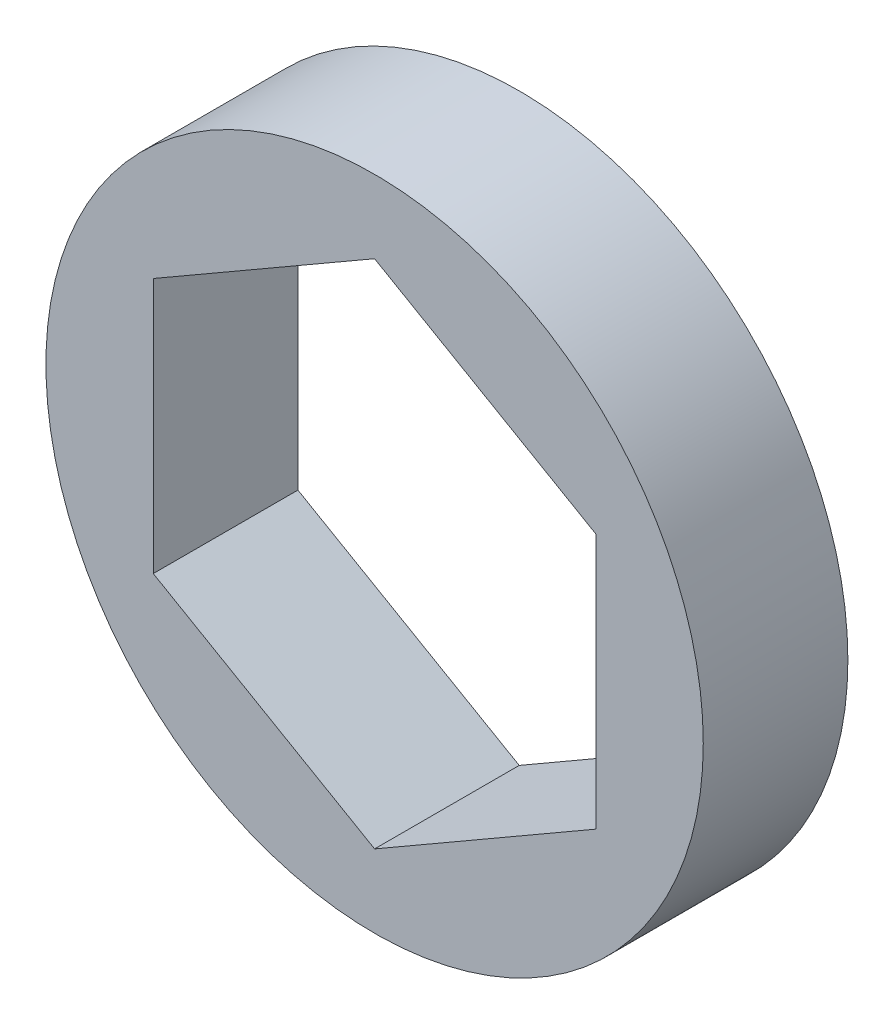
ISO-10303-21;
HEADER;
FILE_DESCRIPTION(('STEP AP214'),'2;1');
FILE_NAME('part.step','',(''),(''),'','','');
FILE_SCHEMA(('AUTOMOTIVE_DESIGN { 1 0 10303 214 1 1 1 1 }'));
ENDSEC;
DATA;
#1=APPLICATION_CONTEXT('core data for automotive mechanical design processes');
#2=APPLICATION_PROTOCOL_DEFINITION('international standard','automotive_design',2000,#1);
#3=PRODUCT_CONTEXT('',#1,'mechanical');
#4=PRODUCT('Part','Part','',(#3));
#5=PRODUCT_RELATED_PRODUCT_CATEGORY('part','',(#4));
#6=PRODUCT_DEFINITION_FORMATION('','',#4);
#7=PRODUCT_DEFINITION_CONTEXT('part definition',#1,'design');
#8=PRODUCT_DEFINITION('design','',#6,#7);
#9=PRODUCT_DEFINITION_SHAPE('','',#8);
#10=(LENGTH_UNIT() NAMED_UNIT(*) SI_UNIT(.MILLI.,.METRE.));
#11=(NAMED_UNIT(*) PLANE_ANGLE_UNIT() SI_UNIT($,.RADIAN.));
#12=(NAMED_UNIT(*) SI_UNIT($,.STERADIAN.) SOLID_ANGLE_UNIT());
#13=UNCERTAINTY_MEASURE_WITH_UNIT(LENGTH_MEASURE(1.E-05),#10,'distance_accuracy_value','');
#14=(GEOMETRIC_REPRESENTATION_CONTEXT(3) GLOBAL_UNCERTAINTY_ASSIGNED_CONTEXT((#13)) GLOBAL_UNIT_ASSIGNED_CONTEXT((#10,
#11,#12)) REPRESENTATION_CONTEXT('',''));
#15=CARTESIAN_POINT('',(0.,0.,0.));
#16=DIRECTION('',(0.,0.,1.));
#17=DIRECTION('',(1.,0.,0.));
#18=AXIS2_PLACEMENT_3D('',#15,#16,#17);
#19=CARTESIAN_POINT('',(0.,0.,4.191));
#20=DIRECTION('',(0.,0.,1.));
#21=DIRECTION('',(1.,0.,0.));
#22=AXIS2_PLACEMENT_3D('',#19,#20,#21);
#23=PLANE('',#22);
#24=CARTESIAN_POINT('',(0.,0.,4.191));
#25=DIRECTION('',(0.,0.,1.));
#26=DIRECTION('',(1.,0.,0.));
#27=AXIS2_PLACEMENT_3D('',#24,#25,#26);
#28=CIRCLE('',#27,9.525);
#29=CARTESIAN_POINT('',(9.525,0.,4.191));
#30=VERTEX_POINT('',#29);
#31=EDGE_CURVE('E11',#30,#30,#28,.T.);
#32=ORIENTED_EDGE('',*,*,#31,.T.);
#33=EDGE_LOOP('',(#32));
#34=FACE_BOUND('',#33,.T.);
#35=DIRECTION('',(-0.866025403784439,0.5,0.));
#36=VECTOR('',#35,1.);
#37=CARTESIAN_POINT('',(6.4135,3.70283595144767,4.191));
#38=LINE('',#37,#36);
#39=CARTESIAN_POINT('',(6.4135,3.70283595144767,4.191));
#40=VERTEX_POINT('',#39);
#41=CARTESIAN_POINT('',(0.,7.40567190289533,4.191));
#42=VERTEX_POINT('',#41);
#43=EDGE_CURVE('E112',#40,#42,#38,.T.);
#44=ORIENTED_EDGE('',*,*,#43,.F.);
#45=DIRECTION('',(0.,1.,0.));
#46=VECTOR('',#45,1.);
#47=CARTESIAN_POINT('',(6.4135,-3.70283595144767,4.191));
#48=LINE('',#47,#46);
#49=CARTESIAN_POINT('',(6.4135,-3.70283595144767,4.191));
#50=VERTEX_POINT('',#49);
#51=EDGE_CURVE('E103',#50,#40,#48,.T.);
#52=ORIENTED_EDGE('',*,*,#51,.F.);
#53=DIRECTION('',(0.866025403784439,0.5,0.));
#54=VECTOR('',#53,1.);
#55=CARTESIAN_POINT('',(0.,-7.40567190289533,4.191));
#56=LINE('',#55,#54);
#57=CARTESIAN_POINT('',(0.,-7.40567190289533,4.191));
#58=VERTEX_POINT('',#57);
#59=EDGE_CURVE('E137',#58,#50,#56,.T.);
#60=ORIENTED_EDGE('',*,*,#59,.F.);
#61=DIRECTION('',(0.866025403784439,-0.5,0.));
#62=VECTOR('',#61,1.);
#63=CARTESIAN_POINT('',(-6.4135,-3.70283595144767,4.191));
#64=LINE('',#63,#62);
#65=CARTESIAN_POINT('',(-6.4135,-3.70283595144767,4.191));
#66=VERTEX_POINT('',#65);
#67=EDGE_CURVE('E134',#66,#58,#64,.T.);
#68=ORIENTED_EDGE('',*,*,#67,.F.);
#69=DIRECTION('',(0.,-1.,0.));
#70=VECTOR('',#69,1.);
#71=CARTESIAN_POINT('',(-6.4135,3.70283595144767,4.191));
#72=LINE('',#71,#70);
#73=CARTESIAN_POINT('',(-6.4135,3.70283595144767,4.191));
#74=VERTEX_POINT('',#73);
#75=EDGE_CURVE('E129',#74,#66,#72,.T.);
#76=ORIENTED_EDGE('',*,*,#75,.F.);
#77=DIRECTION('',(-0.866025403784439,-0.5,0.));
#78=VECTOR('',#77,1.);
#79=CARTESIAN_POINT('',(0.,7.40567190289533,4.191));
#80=LINE('',#79,#78);
#81=EDGE_CURVE('E125',#42,#74,#80,.T.);
#82=ORIENTED_EDGE('',*,*,#81,.F.);
#83=EDGE_LOOP('',(#44,#52,#60,#68,#76,#82));
#84=FACE_BOUND('',#83,.T.);
#85=ADVANCED_FACE('F49',(#34,#84),#23,.T.);
#86=CARTESIAN_POINT('',(0.,0.,0.));
#87=DIRECTION('',(0.,0.,1.));
#88=DIRECTION('',(1.,0.,0.));
#89=AXIS2_PLACEMENT_3D('',#86,#87,#88);
#90=PLANE('',#89);
#91=CARTESIAN_POINT('',(0.,0.,0.));
#92=DIRECTION('',(0.,0.,1.));
#93=DIRECTION('',(1.,0.,0.));
#94=AXIS2_PLACEMENT_3D('',#91,#92,#93);
#95=CIRCLE('',#94,9.525);
#96=CARTESIAN_POINT('',(9.525,0.,0.));
#97=VERTEX_POINT('',#96);
#98=EDGE_CURVE('E53',#97,#97,#95,.T.);
#99=ORIENTED_EDGE('',*,*,#98,.F.);
#100=EDGE_LOOP('',(#99));
#101=FACE_BOUND('',#100,.T.);
#102=DIRECTION('',(0.,1.,0.));
#103=VECTOR('',#102,1.);
#104=CARTESIAN_POINT('',(6.4135,-3.70283595144767,0.));
#105=LINE('',#104,#103);
#106=CARTESIAN_POINT('',(6.4135,-3.70283595144767,0.));
#107=VERTEX_POINT('',#106);
#108=CARTESIAN_POINT('',(6.4135,3.70283595144767,0.));
#109=VERTEX_POINT('',#108);
#110=EDGE_CURVE('E73',#107,#109,#105,.T.);
#111=ORIENTED_EDGE('',*,*,#110,.T.);
#112=DIRECTION('',(-0.866025403784439,0.5,0.));
#113=VECTOR('',#112,1.);
#114=CARTESIAN_POINT('',(6.4135,3.70283595144767,0.));
#115=LINE('',#114,#113);
#116=CARTESIAN_POINT('',(0.,7.40567190289533,0.));
#117=VERTEX_POINT('',#116);
#118=EDGE_CURVE('E119',#109,#117,#115,.T.);
#119=ORIENTED_EDGE('',*,*,#118,.T.);
#120=DIRECTION('',(-0.866025403784439,-0.5,0.));
#121=VECTOR('',#120,1.);
#122=CARTESIAN_POINT('',(0.,7.40567190289533,0.));
#123=LINE('',#122,#121);
#124=CARTESIAN_POINT('',(-6.4135,3.70283595144767,0.));
#125=VERTEX_POINT('',#124);
#126=EDGE_CURVE('E144',#117,#125,#123,.T.);
#127=ORIENTED_EDGE('',*,*,#126,.T.);
#128=DIRECTION('',(0.,-1.,0.));
#129=VECTOR('',#128,1.);
#130=CARTESIAN_POINT('',(-6.4135,3.70283595144767,0.));
#131=LINE('',#130,#129);
#132=CARTESIAN_POINT('',(-6.4135,-3.70283595144767,0.));
#133=VERTEX_POINT('',#132);
#134=EDGE_CURVE('E148',#125,#133,#131,.T.);
#135=ORIENTED_EDGE('',*,*,#134,.T.);
#136=DIRECTION('',(0.866025403784439,-0.5,0.));
#137=VECTOR('',#136,1.);
#138=CARTESIAN_POINT('',(-6.4135,-3.70283595144767,0.));
#139=LINE('',#138,#137);
#140=CARTESIAN_POINT('',(0.,-7.40567190289533,0.));
#141=VERTEX_POINT('',#140);
#142=EDGE_CURVE('E152',#133,#141,#139,.T.);
#143=ORIENTED_EDGE('',*,*,#142,.T.);
#144=DIRECTION('',(0.866025403784439,0.5,0.));
#145=VECTOR('',#144,1.);
#146=CARTESIAN_POINT('',(0.,-7.40567190289533,0.));
#147=LINE('',#146,#145);
#148=EDGE_CURVE('E113',#141,#107,#147,.T.);
#149=ORIENTED_EDGE('',*,*,#148,.T.);
#150=EDGE_LOOP('',(#111,#119,#127,#135,#143,#149));
#151=FACE_BOUND('',#150,.T.);
#152=ADVANCED_FACE('F176',(#101,#151),#90,.F.);
#153=CARTESIAN_POINT('',(0.,0.,4.191));
#154=DIRECTION('',(0.,0.,-1.));
#155=DIRECTION('',(-1.,0.,0.));
#156=AXIS2_PLACEMENT_3D('',#153,#154,#155);
#157=CYLINDRICAL_SURFACE('',#156,9.525);
#158=ORIENTED_EDGE('',*,*,#31,.F.);
#159=EDGE_LOOP('',(#158));
#160=FACE_BOUND('',#159,.T.);
#161=ORIENTED_EDGE('',*,*,#98,.T.);
#162=EDGE_LOOP('',(#161));
#163=FACE_BOUND('',#162,.T.);
#164=ADVANCED_FACE('F51',(#160,#163),#157,.T.);
#165=CARTESIAN_POINT('',(6.4135,-3.70283595144767,4.191));
#166=DIRECTION('',(-1.,0.,0.));
#167=DIRECTION('',(0.,-1.,0.));
#168=AXIS2_PLACEMENT_3D('',#165,#166,#167);
#169=PLANE('',#168);
#170=ORIENTED_EDGE('',*,*,#110,.F.);
#171=DIRECTION('',(0.,0.,-1.));
#172=VECTOR('',#171,1.);
#173=CARTESIAN_POINT('',(6.4135,-3.70283595144767,4.191));
#174=LINE('',#173,#172);
#175=EDGE_CURVE('E107',#50,#107,#174,.T.);
#176=ORIENTED_EDGE('',*,*,#175,.F.);
#177=ORIENTED_EDGE('',*,*,#51,.T.);
#178=DIRECTION('',(0.,0.,-1.));
#179=VECTOR('',#178,1.);
#180=CARTESIAN_POINT('',(6.4135,3.70283595144767,4.191));
#181=LINE('',#180,#179);
#182=EDGE_CURVE('E106',#40,#109,#181,.T.);
#183=ORIENTED_EDGE('',*,*,#182,.T.);
#184=EDGE_LOOP('',(#170,#176,#177,#183));
#185=FACE_BOUND('',#184,.T.);
#186=ADVANCED_FACE('F105',(#185),#169,.T.);
#187=CARTESIAN_POINT('',(6.4135,3.70283595144767,4.191));
#188=DIRECTION('',(-0.5,-0.866025403784439,0.));
#189=DIRECTION('',(0.866025403784439,-0.5,0.));
#190=AXIS2_PLACEMENT_3D('',#187,#188,#189);
#191=PLANE('',#190);
#192=ORIENTED_EDGE('',*,*,#118,.F.);
#193=ORIENTED_EDGE('',*,*,#182,.F.);
#194=ORIENTED_EDGE('',*,*,#43,.T.);
#195=DIRECTION('',(0.,0.,-1.));
#196=VECTOR('',#195,1.);
#197=CARTESIAN_POINT('',(0.,7.40567190289533,4.191));
#198=LINE('',#197,#196);
#199=EDGE_CURVE('E121',#42,#117,#198,.T.);
#200=ORIENTED_EDGE('',*,*,#199,.T.);
#201=EDGE_LOOP('',(#192,#193,#194,#200));
#202=FACE_BOUND('',#201,.T.);
#203=ADVANCED_FACE('F116',(#202),#191,.T.);
#204=CARTESIAN_POINT('',(0.,7.40567190289533,4.191));
#205=DIRECTION('',(0.5,-0.866025403784439,0.));
#206=DIRECTION('',(0.866025403784439,0.5,0.));
#207=AXIS2_PLACEMENT_3D('',#204,#205,#206);
#208=PLANE('',#207);
#209=ORIENTED_EDGE('',*,*,#126,.F.);
#210=ORIENTED_EDGE('',*,*,#199,.F.);
#211=ORIENTED_EDGE('',*,*,#81,.T.);
#212=DIRECTION('',(0.,0.,-1.));
#213=VECTOR('',#212,1.);
#214=CARTESIAN_POINT('',(-6.4135,3.70283595144767,4.191));
#215=LINE('',#214,#213);
#216=EDGE_CURVE('E166',#74,#125,#215,.T.);
#217=ORIENTED_EDGE('',*,*,#216,.T.);
#218=EDGE_LOOP('',(#209,#210,#211,#217));
#219=FACE_BOUND('',#218,.T.);
#220=ADVANCED_FACE('F172',(#219),#208,.T.);
#221=CARTESIAN_POINT('',(-6.4135,3.70283595144767,4.191));
#222=DIRECTION('',(1.,0.,0.));
#223=DIRECTION('',(0.,1.,0.));
#224=AXIS2_PLACEMENT_3D('',#221,#222,#223);
#225=PLANE('',#224);
#226=ORIENTED_EDGE('',*,*,#134,.F.);
#227=ORIENTED_EDGE('',*,*,#216,.F.);
#228=ORIENTED_EDGE('',*,*,#75,.T.);
#229=DIRECTION('',(0.,0.,-1.));
#230=VECTOR('',#229,1.);
#231=CARTESIAN_POINT('',(-6.4135,-3.70283595144767,4.191));
#232=LINE('',#231,#230);
#233=EDGE_CURVE('E163',#66,#133,#232,.T.);
#234=ORIENTED_EDGE('',*,*,#233,.T.);
#235=EDGE_LOOP('',(#226,#227,#228,#234));
#236=FACE_BOUND('',#235,.T.);
#237=ADVANCED_FACE('F184',(#236),#225,.T.);
#238=CARTESIAN_POINT('',(-6.4135,-3.70283595144767,4.191));
#239=DIRECTION('',(0.5,0.866025403784439,0.));
#240=DIRECTION('',(-0.866025403784439,0.5,0.));
#241=AXIS2_PLACEMENT_3D('',#238,#239,#240);
#242=PLANE('',#241);
#243=ORIENTED_EDGE('',*,*,#142,.F.);
#244=ORIENTED_EDGE('',*,*,#233,.F.);
#245=ORIENTED_EDGE('',*,*,#67,.T.);
#246=DIRECTION('',(0.,0.,-1.));
#247=VECTOR('',#246,1.);
#248=CARTESIAN_POINT('',(0.,-7.40567190289533,4.191));
#249=LINE('',#248,#247);
#250=EDGE_CURVE('E65',#58,#141,#249,.T.);
#251=ORIENTED_EDGE('',*,*,#250,.T.);
#252=EDGE_LOOP('',(#243,#244,#245,#251));
#253=FACE_BOUND('',#252,.T.);
#254=ADVANCED_FACE('F182',(#253),#242,.T.);
#255=CARTESIAN_POINT('',(0.,-7.40567190289533,4.191));
#256=DIRECTION('',(-0.5,0.866025403784439,0.));
#257=DIRECTION('',(-0.866025403784439,-0.5,0.));
#258=AXIS2_PLACEMENT_3D('',#255,#256,#257);
#259=PLANE('',#258);
#260=ORIENTED_EDGE('',*,*,#148,.F.);
#261=ORIENTED_EDGE('',*,*,#250,.F.);
#262=ORIENTED_EDGE('',*,*,#59,.T.);
#263=ORIENTED_EDGE('',*,*,#175,.T.);
#264=EDGE_LOOP('',(#260,#261,#262,#263));
#265=FACE_BOUND('',#264,.T.);
#266=ADVANCED_FACE('F178',(#265),#259,.T.);
#267=CLOSED_SHELL('',(#85,#152,#164,#186,#203,#220,#237,#254,#266));
#268=MANIFOLD_SOLID_BREP('B2',#267);
#269=ADVANCED_BREP_SHAPE_REPRESENTATION('',(#18,#268),#14);
#270=SHAPE_DEFINITION_REPRESENTATION(#9,#269);
ENDSEC;
END-ISO-10303-21;
